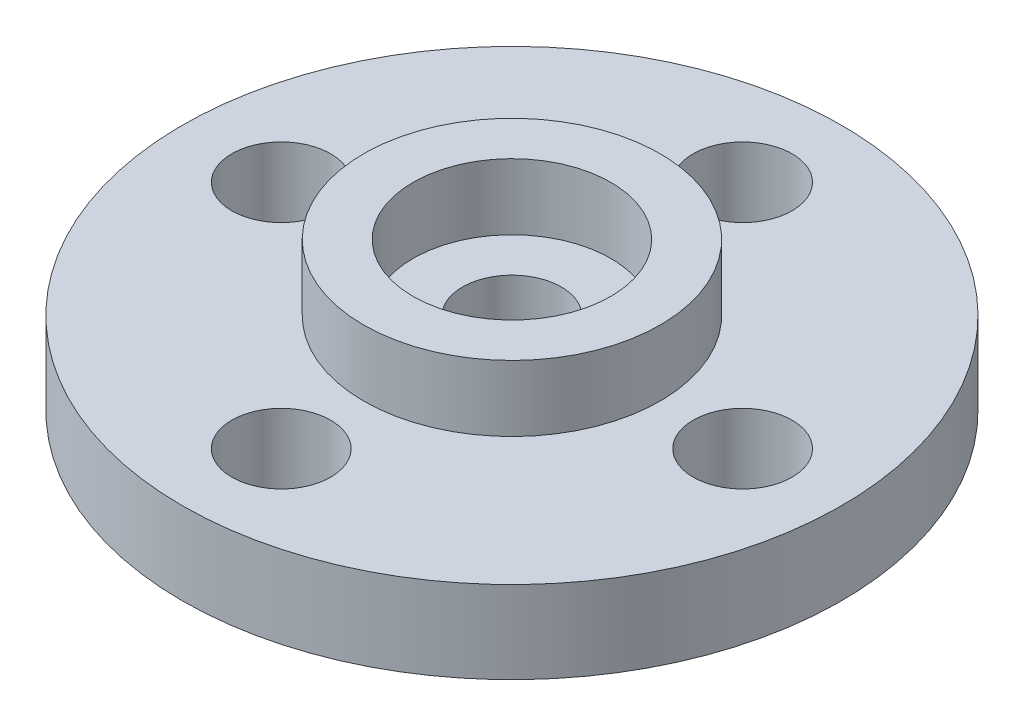
ISO-10303-21;
HEADER;
FILE_DESCRIPTION(('STEP AP214'),'2;1');
FILE_NAME('part.step','',(''),(''),'','','');
FILE_SCHEMA(('AUTOMOTIVE_DESIGN { 1 0 10303 214 1 1 1 1 }'));
ENDSEC;
DATA;
#1=APPLICATION_CONTEXT('core data for automotive mechanical design processes');
#2=APPLICATION_PROTOCOL_DEFINITION('international standard','automotive_design',2000,#1);
#3=PRODUCT_CONTEXT('',#1,'mechanical');
#4=PRODUCT('Part','Part','',(#3));
#5=PRODUCT_RELATED_PRODUCT_CATEGORY('part','',(#4));
#6=PRODUCT_DEFINITION_FORMATION('','',#4);
#7=PRODUCT_DEFINITION_CONTEXT('part definition',#1,'design');
#8=PRODUCT_DEFINITION('design','',#6,#7);
#9=PRODUCT_DEFINITION_SHAPE('','',#8);
#10=(LENGTH_UNIT() NAMED_UNIT(*) SI_UNIT(.MILLI.,.METRE.));
#11=(NAMED_UNIT(*) PLANE_ANGLE_UNIT() SI_UNIT($,.RADIAN.));
#12=(NAMED_UNIT(*) SI_UNIT($,.STERADIAN.) SOLID_ANGLE_UNIT());
#13=UNCERTAINTY_MEASURE_WITH_UNIT(LENGTH_MEASURE(1.E-05),#10,'distance_accuracy_value','');
#14=(GEOMETRIC_REPRESENTATION_CONTEXT(3) GLOBAL_UNCERTAINTY_ASSIGNED_CONTEXT((#13)) GLOBAL_UNIT_ASSIGNED_CONTEXT((#10,
#11,#12)) REPRESENTATION_CONTEXT('',''));
#15=CARTESIAN_POINT('',(0.,0.,0.));
#16=DIRECTION('',(0.,0.,1.));
#17=DIRECTION('',(1.,0.,0.));
#18=AXIS2_PLACEMENT_3D('',#15,#16,#17);
#19=CARTESIAN_POINT('',(0.,2.5,0.));
#20=DIRECTION('',(0.,1.,0.));
#21=DIRECTION('',(0.,0.,1.));
#22=AXIS2_PLACEMENT_3D('',#19,#20,#21);
#23=PLANE('',#22);
#24=CARTESIAN_POINT('',(0.,2.5,0.));
#25=DIRECTION('',(0.,1.,0.));
#26=DIRECTION('',(0.,0.,1.));
#27=AXIS2_PLACEMENT_3D('',#24,#25,#26);
#28=CIRCLE('',#27,1.5);
#29=CARTESIAN_POINT('',(0.,2.5,1.5));
#30=VERTEX_POINT('',#29);
#31=EDGE_CURVE('E58',#30,#30,#28,.T.);
#32=ORIENTED_EDGE('',*,*,#31,.F.);
#33=EDGE_LOOP('',(#32));
#34=FACE_BOUND('',#33,.T.);
#35=CARTESIAN_POINT('',(0.,2.5,0.));
#36=DIRECTION('',(0.,1.,0.));
#37=DIRECTION('',(0.,0.,1.));
#38=AXIS2_PLACEMENT_3D('',#35,#36,#37);
#39=CIRCLE('',#38,3.);
#40=CARTESIAN_POINT('',(0.,2.5,3.));
#41=VERTEX_POINT('',#40);
#42=EDGE_CURVE('E10',#41,#41,#39,.F.);
#43=ORIENTED_EDGE('',*,*,#42,.F.);
#44=EDGE_LOOP('',(#43));
#45=FACE_BOUND('',#44,.T.);
#46=ADVANCED_FACE('F45',(#34,#45),#23,.T.);
#47=CARTESIAN_POINT('',(0.,2.5,0.));
#48=DIRECTION('',(0.,-1.,0.));
#49=DIRECTION('',(0.,0.,-1.));
#50=AXIS2_PLACEMENT_3D('',#47,#48,#49);
#51=CYLINDRICAL_SURFACE('',#50,1.5);
#52=ORIENTED_EDGE('',*,*,#31,.T.);
#53=EDGE_LOOP('',(#52));
#54=FACE_BOUND('',#53,.T.);
#55=CARTESIAN_POINT('',(0.,0.,0.));
#56=DIRECTION('',(0.,1.,0.));
#57=DIRECTION('',(0.,0.,1.));
#58=AXIS2_PLACEMENT_3D('',#55,#56,#57);
#59=CIRCLE('',#58,1.5);
#60=CARTESIAN_POINT('',(0.,0.,1.5));
#61=VERTEX_POINT('',#60);
#62=EDGE_CURVE('E85',#61,#61,#59,.T.);
#63=ORIENTED_EDGE('',*,*,#62,.F.);
#64=EDGE_LOOP('',(#63));
#65=FACE_BOUND('',#64,.T.);
#66=ADVANCED_FACE('F137',(#54,#65),#51,.F.);
#67=CARTESIAN_POINT('',(0.,2.5,-7.));
#68=DIRECTION('',(0.,-1.,0.));
#69=DIRECTION('',(0.,0.,-1.));
#70=AXIS2_PLACEMENT_3D('',#67,#68,#69);
#71=CYLINDRICAL_SURFACE('',#70,1.5);
#72=CARTESIAN_POINT('',(0.,2.5,-7.));
#73=DIRECTION('',(0.,1.,0.));
#74=DIRECTION('',(0.,0.,1.));
#75=AXIS2_PLACEMENT_3D('',#72,#73,#74);
#76=CIRCLE('',#75,1.5);
#77=CARTESIAN_POINT('',(0.,2.5,-5.5));
#78=VERTEX_POINT('',#77);
#79=EDGE_CURVE('E64',#78,#78,#76,.T.);
#80=ORIENTED_EDGE('',*,*,#79,.T.);
#81=EDGE_LOOP('',(#80));
#82=FACE_BOUND('',#81,.T.);
#83=CARTESIAN_POINT('',(0.,0.,-7.));
#84=DIRECTION('',(0.,1.,0.));
#85=DIRECTION('',(0.,0.,1.));
#86=AXIS2_PLACEMENT_3D('',#83,#84,#85);
#87=CIRCLE('',#86,1.5);
#88=CARTESIAN_POINT('',(0.,0.,-5.5));
#89=VERTEX_POINT('',#88);
#90=EDGE_CURVE('E81',#89,#89,#87,.T.);
#91=ORIENTED_EDGE('',*,*,#90,.F.);
#92=EDGE_LOOP('',(#91));
#93=FACE_BOUND('',#92,.T.);
#94=ADVANCED_FACE('F114',(#82,#93),#71,.F.);
#95=CARTESIAN_POINT('',(7.,2.5,0.));
#96=DIRECTION('',(0.,-1.,0.));
#97=DIRECTION('',(0.,0.,-1.));
#98=AXIS2_PLACEMENT_3D('',#95,#96,#97);
#99=CYLINDRICAL_SURFACE('',#98,1.5);
#100=CARTESIAN_POINT('',(7.,2.5,0.));
#101=DIRECTION('',(0.,1.,0.));
#102=DIRECTION('',(0.,0.,1.));
#103=AXIS2_PLACEMENT_3D('',#100,#101,#102);
#104=CIRCLE('',#103,1.5);
#105=CARTESIAN_POINT('',(7.,2.5,1.5));
#106=VERTEX_POINT('',#105);
#107=EDGE_CURVE('E102',#106,#106,#104,.T.);
#108=ORIENTED_EDGE('',*,*,#107,.T.);
#109=EDGE_LOOP('',(#108));
#110=FACE_BOUND('',#109,.T.);
#111=CARTESIAN_POINT('',(7.,0.,0.));
#112=DIRECTION('',(0.,1.,0.));
#113=DIRECTION('',(0.,0.,1.));
#114=AXIS2_PLACEMENT_3D('',#111,#112,#113);
#115=CIRCLE('',#114,1.5);
#116=CARTESIAN_POINT('',(7.,0.,1.5));
#117=VERTEX_POINT('',#116);
#118=EDGE_CURVE('E77',#117,#117,#115,.T.);
#119=ORIENTED_EDGE('',*,*,#118,.F.);
#120=EDGE_LOOP('',(#119));
#121=FACE_BOUND('',#120,.T.);
#122=ADVANCED_FACE('F153',(#110,#121),#99,.F.);
#123=CARTESIAN_POINT('',(0.,2.5,7.));
#124=DIRECTION('',(0.,-1.,0.));
#125=DIRECTION('',(0.,0.,-1.));
#126=AXIS2_PLACEMENT_3D('',#123,#124,#125);
#127=CYLINDRICAL_SURFACE('',#126,1.5);
#128=CARTESIAN_POINT('',(0.,2.5,7.));
#129=DIRECTION('',(0.,1.,0.));
#130=DIRECTION('',(0.,0.,1.));
#131=AXIS2_PLACEMENT_3D('',#128,#129,#130);
#132=CIRCLE('',#131,1.5);
#133=CARTESIAN_POINT('',(0.,2.5,8.5));
#134=VERTEX_POINT('',#133);
#135=EDGE_CURVE('E96',#134,#134,#132,.T.);
#136=ORIENTED_EDGE('',*,*,#135,.T.);
#137=EDGE_LOOP('',(#136));
#138=FACE_BOUND('',#137,.T.);
#139=CARTESIAN_POINT('',(0.,0.,7.));
#140=DIRECTION('',(0.,1.,0.));
#141=DIRECTION('',(0.,0.,1.));
#142=AXIS2_PLACEMENT_3D('',#139,#140,#141);
#143=CIRCLE('',#142,1.5);
#144=CARTESIAN_POINT('',(0.,0.,8.5));
#145=VERTEX_POINT('',#144);
#146=EDGE_CURVE('E72',#145,#145,#143,.T.);
#147=ORIENTED_EDGE('',*,*,#146,.F.);
#148=EDGE_LOOP('',(#147));
#149=FACE_BOUND('',#148,.T.);
#150=ADVANCED_FACE('F157',(#138,#149),#127,.F.);
#151=CARTESIAN_POINT('',(-7.,2.5,0.));
#152=DIRECTION('',(0.,-1.,0.));
#153=DIRECTION('',(0.,0.,-1.));
#154=AXIS2_PLACEMENT_3D('',#151,#152,#153);
#155=CYLINDRICAL_SURFACE('',#154,1.5);
#156=CARTESIAN_POINT('',(-7.,2.5,0.));
#157=DIRECTION('',(0.,1.,0.));
#158=DIRECTION('',(0.,0.,1.));
#159=AXIS2_PLACEMENT_3D('',#156,#157,#158);
#160=CIRCLE('',#159,1.5);
#161=CARTESIAN_POINT('',(-7.,2.5,1.5));
#162=VERTEX_POINT('',#161);
#163=EDGE_CURVE('E91',#162,#162,#160,.T.);
#164=ORIENTED_EDGE('',*,*,#163,.T.);
#165=EDGE_LOOP('',(#164));
#166=FACE_BOUND('',#165,.T.);
#167=CARTESIAN_POINT('',(-7.,0.,0.));
#168=DIRECTION('',(0.,1.,0.));
#169=DIRECTION('',(0.,0.,1.));
#170=AXIS2_PLACEMENT_3D('',#167,#168,#169);
#171=CIRCLE('',#170,1.5);
#172=CARTESIAN_POINT('',(-7.,0.,1.5));
#173=VERTEX_POINT('',#172);
#174=EDGE_CURVE('E68',#173,#173,#171,.T.);
#175=ORIENTED_EDGE('',*,*,#174,.F.);
#176=EDGE_LOOP('',(#175));
#177=FACE_BOUND('',#176,.T.);
#178=ADVANCED_FACE('F47',(#166,#177),#155,.F.);
#179=CARTESIAN_POINT('',(0.,2.5,0.));
#180=DIRECTION('',(0.,-1.,0.));
#181=DIRECTION('',(0.,0.,-1.));
#182=AXIS2_PLACEMENT_3D('',#179,#180,#181);
#183=CYLINDRICAL_SURFACE('',#182,10.);
#184=CARTESIAN_POINT('',(0.,2.5,0.));
#185=DIRECTION('',(0.,1.,0.));
#186=DIRECTION('',(0.,0.,1.));
#187=AXIS2_PLACEMENT_3D('',#184,#185,#186);
#188=CIRCLE('',#187,10.);
#189=CARTESIAN_POINT('',(0.,2.5,10.));
#190=VERTEX_POINT('',#189);
#191=EDGE_CURVE('E53',#190,#190,#188,.T.);
#192=ORIENTED_EDGE('',*,*,#191,.F.);
#193=EDGE_LOOP('',(#192));
#194=FACE_BOUND('',#193,.T.);
#195=CARTESIAN_POINT('',(0.,0.,0.));
#196=DIRECTION('',(0.,1.,0.));
#197=DIRECTION('',(0.,0.,1.));
#198=AXIS2_PLACEMENT_3D('',#195,#196,#197);
#199=CIRCLE('',#198,10.);
#200=CARTESIAN_POINT('',(0.,0.,10.));
#201=VERTEX_POINT('',#200);
#202=EDGE_CURVE('E88',#201,#201,#199,.T.);
#203=ORIENTED_EDGE('',*,*,#202,.T.);
#204=EDGE_LOOP('',(#203));
#205=FACE_BOUND('',#204,.T.);
#206=ADVANCED_FACE('F120',(#194,#205),#183,.T.);
#207=CARTESIAN_POINT('',(0.,2.5,0.));
#208=DIRECTION('',(0.,1.,0.));
#209=DIRECTION('',(0.,0.,1.));
#210=AXIS2_PLACEMENT_3D('',#207,#208,#209);
#211=CIRCLE('',#210,4.5);
#212=CARTESIAN_POINT('',(0.,2.5,4.5));
#213=VERTEX_POINT('',#212);
#214=EDGE_CURVE('E105',#213,#213,#211,.T.);
#215=ORIENTED_EDGE('',*,*,#214,.F.);
#216=EDGE_LOOP('',(#215));
#217=FACE_BOUND('',#216,.T.);
#218=ORIENTED_EDGE('',*,*,#163,.F.);
#219=EDGE_LOOP('',(#218));
#220=FACE_BOUND('',#219,.T.);
#221=ORIENTED_EDGE('',*,*,#135,.F.);
#222=EDGE_LOOP('',(#221));
#223=FACE_BOUND('',#222,.T.);
#224=ORIENTED_EDGE('',*,*,#107,.F.);
#225=EDGE_LOOP('',(#224));
#226=FACE_BOUND('',#225,.T.);
#227=ORIENTED_EDGE('',*,*,#79,.F.);
#228=EDGE_LOOP('',(#227));
#229=FACE_BOUND('',#228,.T.);
#230=ORIENTED_EDGE('',*,*,#191,.T.);
#231=EDGE_LOOP('',(#230));
#232=FACE_BOUND('',#231,.T.);
#233=ADVANCED_FACE('F117',(#217,#220,#223,#226,#229,#232),#23,.T.);
#234=CARTESIAN_POINT('',(0.,0.,0.));
#235=DIRECTION('',(0.,1.,0.));
#236=DIRECTION('',(0.,0.,1.));
#237=AXIS2_PLACEMENT_3D('',#234,#235,#236);
#238=PLANE('',#237);
#239=ORIENTED_EDGE('',*,*,#174,.T.);
#240=EDGE_LOOP('',(#239));
#241=FACE_BOUND('',#240,.T.);
#242=ORIENTED_EDGE('',*,*,#146,.T.);
#243=EDGE_LOOP('',(#242));
#244=FACE_BOUND('',#243,.T.);
#245=ORIENTED_EDGE('',*,*,#118,.T.);
#246=EDGE_LOOP('',(#245));
#247=FACE_BOUND('',#246,.T.);
#248=ORIENTED_EDGE('',*,*,#90,.T.);
#249=EDGE_LOOP('',(#248));
#250=FACE_BOUND('',#249,.T.);
#251=ORIENTED_EDGE('',*,*,#62,.T.);
#252=EDGE_LOOP('',(#251));
#253=FACE_BOUND('',#252,.T.);
#254=ORIENTED_EDGE('',*,*,#202,.F.);
#255=EDGE_LOOP('',(#254));
#256=FACE_BOUND('',#255,.T.);
#257=ADVANCED_FACE('F119',(#241,#244,#247,#250,#253,#256),#238,.F.);
#258=CARTESIAN_POINT('',(0.,4.5,0.));
#259=DIRECTION('',(0.,1.,0.));
#260=DIRECTION('',(0.,0.,1.));
#261=AXIS2_PLACEMENT_3D('',#258,#259,#260);
#262=PLANE('',#261);
#263=CARTESIAN_POINT('',(0.,4.5,0.));
#264=DIRECTION('',(0.,1.,0.));
#265=DIRECTION('',(0.,0.,1.));
#266=AXIS2_PLACEMENT_3D('',#263,#264,#265);
#267=CIRCLE('',#266,4.5);
#268=CARTESIAN_POINT('',(0.,4.5,4.5));
#269=VERTEX_POINT('',#268);
#270=EDGE_CURVE('E73',#269,#269,#267,.T.);
#271=ORIENTED_EDGE('',*,*,#270,.T.);
#272=EDGE_LOOP('',(#271));
#273=FACE_BOUND('',#272,.T.);
#274=CARTESIAN_POINT('',(0.,4.5,0.));
#275=DIRECTION('',(0.,1.,0.));
#276=DIRECTION('',(0.,0.,1.));
#277=AXIS2_PLACEMENT_3D('',#274,#275,#276);
#278=CIRCLE('',#277,3.);
#279=CARTESIAN_POINT('',(0.,4.5,3.));
#280=VERTEX_POINT('',#279);
#281=EDGE_CURVE('E230',#280,#280,#278,.T.);
#282=ORIENTED_EDGE('',*,*,#281,.F.);
#283=EDGE_LOOP('',(#282));
#284=FACE_BOUND('',#283,.T.);
#285=ADVANCED_FACE('F128',(#273,#284),#262,.T.);
#286=CARTESIAN_POINT('',(0.,4.5,0.));
#287=DIRECTION('',(0.,-1.,0.));
#288=DIRECTION('',(0.,0.,-1.));
#289=AXIS2_PLACEMENT_3D('',#286,#287,#288);
#290=CYLINDRICAL_SURFACE('',#289,4.5);
#291=ORIENTED_EDGE('',*,*,#270,.F.);
#292=EDGE_LOOP('',(#291));
#293=FACE_BOUND('',#292,.T.);
#294=ORIENTED_EDGE('',*,*,#214,.T.);
#295=EDGE_LOOP('',(#294));
#296=FACE_BOUND('',#295,.T.);
#297=ADVANCED_FACE('F206',(#293,#296),#290,.T.);
#298=CARTESIAN_POINT('',(0.,4.5,0.));
#299=DIRECTION('',(0.,-1.,0.));
#300=DIRECTION('',(0.,0.,-1.));
#301=AXIS2_PLACEMENT_3D('',#298,#299,#300);
#302=CYLINDRICAL_SURFACE('',#301,3.);
#303=ORIENTED_EDGE('',*,*,#281,.T.);
#304=EDGE_LOOP('',(#303));
#305=FACE_BOUND('',#304,.T.);
#306=ORIENTED_EDGE('',*,*,#42,.T.);
#307=EDGE_LOOP('',(#306));
#308=FACE_BOUND('',#307,.T.);
#309=ADVANCED_FACE('F216',(#305,#308),#302,.F.);
#310=CLOSED_SHELL('',(#46,#66,#94,#122,#150,#178,#206,#233,#257,#285,#297,#309));
#311=MANIFOLD_SOLID_BREP('B2',#310);
#312=ADVANCED_BREP_SHAPE_REPRESENTATION('',(#18,#311),#14);
#313=SHAPE_DEFINITION_REPRESENTATION(#9,#312);
ENDSEC;
END-ISO-10303-21;
